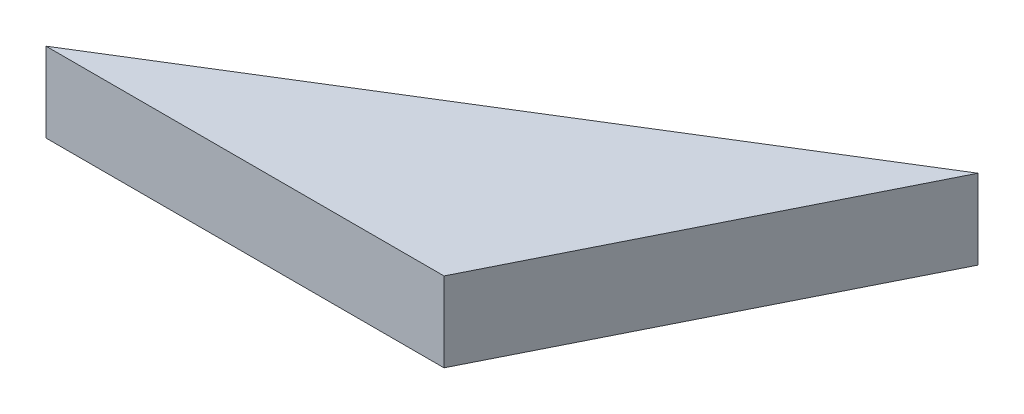
ISO-10303-21;
HEADER;
FILE_DESCRIPTION(('STEP AP214'),'2;1');
FILE_NAME('part.step','',(''),(''),'','','');
FILE_SCHEMA(('AUTOMOTIVE_DESIGN { 1 0 10303 214 1 1 1 1 }'));
ENDSEC;
DATA;
#1=APPLICATION_CONTEXT('core data for automotive mechanical design processes');
#2=APPLICATION_PROTOCOL_DEFINITION('international standard','automotive_design',2000,#1);
#3=PRODUCT_CONTEXT('',#1,'mechanical');
#4=PRODUCT('Part','Part','',(#3));
#5=PRODUCT_RELATED_PRODUCT_CATEGORY('part','',(#4));
#6=PRODUCT_DEFINITION_FORMATION('','',#4);
#7=PRODUCT_DEFINITION_CONTEXT('part definition',#1,'design');
#8=PRODUCT_DEFINITION('design','',#6,#7);
#9=PRODUCT_DEFINITION_SHAPE('','',#8);
#10=(LENGTH_UNIT() NAMED_UNIT(*) SI_UNIT(.MILLI.,.METRE.));
#11=(NAMED_UNIT(*) PLANE_ANGLE_UNIT() SI_UNIT($,.RADIAN.));
#12=(NAMED_UNIT(*) SI_UNIT($,.STERADIAN.) SOLID_ANGLE_UNIT());
#13=UNCERTAINTY_MEASURE_WITH_UNIT(LENGTH_MEASURE(1.E-05),#10,'distance_accuracy_value','');
#14=(GEOMETRIC_REPRESENTATION_CONTEXT(3) GLOBAL_UNCERTAINTY_ASSIGNED_CONTEXT((#13)) GLOBAL_UNIT_ASSIGNED_CONTEXT((#10,
#11,#12)) REPRESENTATION_CONTEXT('',''));
#15=CARTESIAN_POINT('',(0.,0.,0.));
#16=DIRECTION('',(0.,0.,1.));
#17=DIRECTION('',(1.,0.,0.));
#18=AXIS2_PLACEMENT_3D('',#15,#16,#17);
#19=CARTESIAN_POINT('',(0.,6.,0.));
#20=DIRECTION('',(0.,0.,1.));
#21=DIRECTION('',(1.,0.,0.));
#22=AXIS2_PLACEMENT_3D('',#19,#20,#21);
#23=PLANE('',#22);
#24=DIRECTION('',(-1.,0.,0.));
#25=VECTOR('',#24,1.);
#26=CARTESIAN_POINT('',(0.,0.,0.));
#27=LINE('',#26,#25);
#28=CARTESIAN_POINT('',(0.,0.,0.));
#29=VERTEX_POINT('',#28);
#30=CARTESIAN_POINT('',(-30.,0.,0.));
#31=VERTEX_POINT('',#30);
#32=EDGE_CURVE('E85',#29,#31,#27,.T.);
#33=ORIENTED_EDGE('',*,*,#32,.F.);
#34=DIRECTION('',(0.,-1.,0.));
#35=VECTOR('',#34,1.);
#36=CARTESIAN_POINT('',(0.,6.,0.));
#37=LINE('',#36,#35);
#38=CARTESIAN_POINT('',(0.,6.,0.));
#39=VERTEX_POINT('',#38);
#40=EDGE_CURVE('E11',#39,#29,#37,.T.);
#41=ORIENTED_EDGE('',*,*,#40,.F.);
#42=DIRECTION('',(-1.,0.,0.));
#43=VECTOR('',#42,1.);
#44=CARTESIAN_POINT('',(0.,6.,0.));
#45=LINE('',#44,#43);
#46=CARTESIAN_POINT('',(-30.,6.,0.));
#47=VERTEX_POINT('',#46);
#48=EDGE_CURVE('E72',#39,#47,#45,.T.);
#49=ORIENTED_EDGE('',*,*,#48,.T.);
#50=DIRECTION('',(0.,-1.,0.));
#51=VECTOR('',#50,1.);
#52=CARTESIAN_POINT('',(-30.,6.,0.));
#53=LINE('',#52,#51);
#54=EDGE_CURVE('E36',#47,#31,#53,.T.);
#55=ORIENTED_EDGE('',*,*,#54,.T.);
#56=EDGE_LOOP('',(#33,#41,#49,#55));
#57=FACE_BOUND('',#56,.T.);
#58=ADVANCED_FACE('F33',(#57),#23,.T.);
#59=CARTESIAN_POINT('',(0.,6.,0.));
#60=DIRECTION('',(-0.894388560370085,0.,-0.447290848418708));
#61=DIRECTION('',(-0.447290848418708,0.,0.894388560370085));
#62=AXIS2_PLACEMENT_3D('',#59,#60,#61);
#63=PLANE('',#62);
#64=DIRECTION('',(0.447290848418708,0.,-0.894388560370085));
#65=VECTOR('',#64,1.);
#66=CARTESIAN_POINT('',(0.,0.,0.));
#67=LINE('',#66,#65);
#68=CARTESIAN_POINT('',(13.4187254525612,0.,-26.8316568111025));
#69=VERTEX_POINT('',#68);
#70=EDGE_CURVE('E63',#29,#69,#67,.T.);
#71=ORIENTED_EDGE('',*,*,#70,.T.);
#72=DIRECTION('',(0.,-1.,0.));
#73=VECTOR('',#72,1.);
#74=CARTESIAN_POINT('',(13.4187254525612,6.,-26.8316568111025));
#75=LINE('',#74,#73);
#76=CARTESIAN_POINT('',(13.4187254525612,6.,-26.8316568111025));
#77=VERTEX_POINT('',#76);
#78=EDGE_CURVE('E42',#77,#69,#75,.T.);
#79=ORIENTED_EDGE('',*,*,#78,.F.);
#80=DIRECTION('',(0.447290848418708,0.,-0.894388560370085));
#81=VECTOR('',#80,1.);
#82=CARTESIAN_POINT('',(0.,6.,0.));
#83=LINE('',#82,#81);
#84=EDGE_CURVE('E73',#39,#77,#83,.T.);
#85=ORIENTED_EDGE('',*,*,#84,.F.);
#86=ORIENTED_EDGE('',*,*,#40,.T.);
#87=EDGE_LOOP('',(#71,#79,#85,#86));
#88=FACE_BOUND('',#87,.T.);
#89=ADVANCED_FACE('F97',(#88),#63,.F.);
#90=CARTESIAN_POINT('',(13.4187254525612,6.,-26.8316568111025));
#91=DIRECTION('',(0.525694374889675,0.,0.850673512112228));
#92=DIRECTION('',(0.850673512112229,0.,-0.525694374889675));
#93=AXIS2_PLACEMENT_3D('',#90,#91,#92);
#94=PLANE('',#93);
#95=DIRECTION('',(-0.850673512112229,0.,0.525694374889675));
#96=VECTOR('',#95,1.);
#97=CARTESIAN_POINT('',(13.4187254525612,0.,-26.8316568111025));
#98=LINE('',#97,#96);
#99=EDGE_CURVE('E79',#69,#31,#98,.T.);
#100=ORIENTED_EDGE('',*,*,#99,.T.);
#101=ORIENTED_EDGE('',*,*,#54,.F.);
#102=DIRECTION('',(-0.850673512112229,0.,0.525694374889675));
#103=VECTOR('',#102,1.);
#104=CARTESIAN_POINT('',(13.4187254525612,6.,-26.8316568111025));
#105=LINE('',#104,#103);
#106=EDGE_CURVE('E69',#77,#47,#105,.T.);
#107=ORIENTED_EDGE('',*,*,#106,.F.);
#108=ORIENTED_EDGE('',*,*,#78,.T.);
#109=EDGE_LOOP('',(#100,#101,#107,#108));
#110=FACE_BOUND('',#109,.T.);
#111=ADVANCED_FACE('F77',(#110),#94,.F.);
#112=CARTESIAN_POINT('',(0.,6.,0.));
#113=DIRECTION('',(0.,-1.,0.));
#114=DIRECTION('',(0.,0.,-1.));
#115=AXIS2_PLACEMENT_3D('',#112,#113,#114);
#116=PLANE('',#115);
#117=ORIENTED_EDGE('',*,*,#48,.F.);
#118=ORIENTED_EDGE('',*,*,#84,.T.);
#119=ORIENTED_EDGE('',*,*,#106,.T.);
#120=EDGE_LOOP('',(#117,#118,#119));
#121=FACE_BOUND('',#120,.T.);
#122=ADVANCED_FACE('F71',(#121),#116,.F.);
#123=CARTESIAN_POINT('',(0.,0.,0.));
#124=DIRECTION('',(0.,-1.,0.));
#125=DIRECTION('',(0.,0.,-1.));
#126=AXIS2_PLACEMENT_3D('',#123,#124,#125);
#127=PLANE('',#126);
#128=ORIENTED_EDGE('',*,*,#32,.T.);
#129=ORIENTED_EDGE('',*,*,#99,.F.);
#130=ORIENTED_EDGE('',*,*,#70,.F.);
#131=EDGE_LOOP('',(#128,#129,#130));
#132=FACE_BOUND('',#131,.T.);
#133=ADVANCED_FACE('F88',(#132),#127,.T.);
#134=CLOSED_SHELL('',(#58,#89,#111,#122,#133));
#135=MANIFOLD_SOLID_BREP('B2',#134);
#136=ADVANCED_BREP_SHAPE_REPRESENTATION('',(#18,#135),#14);
#137=SHAPE_DEFINITION_REPRESENTATION(#9,#136);
ENDSEC;
END-ISO-10303-21;
